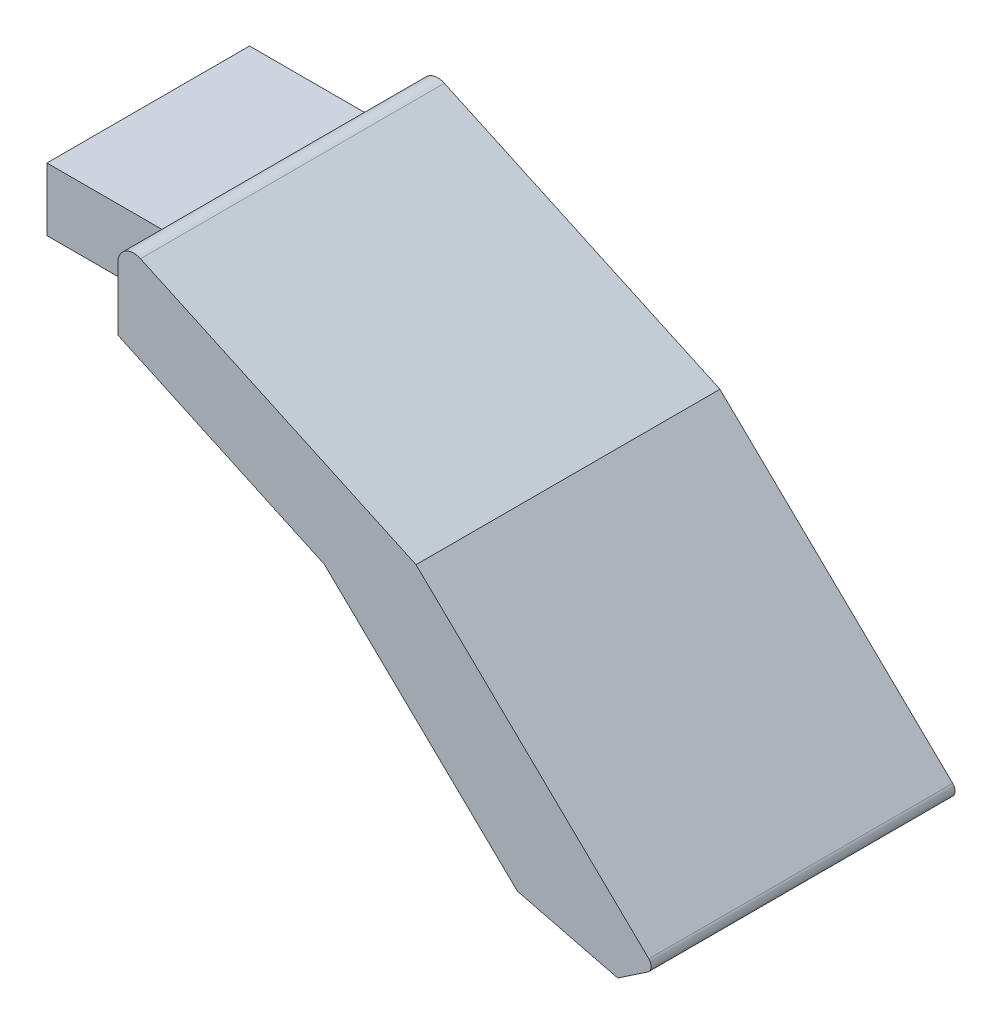
ISO-10303-21;
HEADER;
FILE_DESCRIPTION(('STEP AP214'),'2;1');
FILE_NAME('part.step','',(''),(''),'','','');
FILE_SCHEMA(('AUTOMOTIVE_DESIGN { 1 0 10303 214 1 1 1 1 }'));
ENDSEC;
DATA;
#1=APPLICATION_CONTEXT('core data for automotive mechanical design processes');
#2=APPLICATION_PROTOCOL_DEFINITION('international standard','automotive_design',2000,#1);
#3=PRODUCT_CONTEXT('',#1,'mechanical');
#4=PRODUCT('Part','Part','',(#3));
#5=PRODUCT_RELATED_PRODUCT_CATEGORY('part','',(#4));
#6=PRODUCT_DEFINITION_FORMATION('','',#4);
#7=PRODUCT_DEFINITION_CONTEXT('part definition',#1,'design');
#8=PRODUCT_DEFINITION('design','',#6,#7);
#9=PRODUCT_DEFINITION_SHAPE('','',#8);
#10=(LENGTH_UNIT() NAMED_UNIT(*) SI_UNIT(.MILLI.,.METRE.));
#11=(NAMED_UNIT(*) PLANE_ANGLE_UNIT() SI_UNIT($,.RADIAN.));
#12=(NAMED_UNIT(*) SI_UNIT($,.STERADIAN.) SOLID_ANGLE_UNIT());
#13=UNCERTAINTY_MEASURE_WITH_UNIT(LENGTH_MEASURE(1.E-05),#10,'distance_accuracy_value','');
#14=(GEOMETRIC_REPRESENTATION_CONTEXT(3) GLOBAL_UNCERTAINTY_ASSIGNED_CONTEXT((#13)) GLOBAL_UNIT_ASSIGNED_CONTEXT((#10,
#11,#12)) REPRESENTATION_CONTEXT('',''));
#15=CARTESIAN_POINT('',(0.,0.,0.));
#16=DIRECTION('',(0.,0.,1.));
#17=DIRECTION('',(1.,0.,0.));
#18=AXIS2_PLACEMENT_3D('',#15,#16,#17);
#19=CARTESIAN_POINT('',(20.376413200108,1.84990999305103,15.));
#20=DIRECTION('',(0.694777681754056,0.71922456363535,0.));
#21=DIRECTION('',(-0.71922456363535,0.694777681754056,0.));
#22=AXIS2_PLACEMENT_3D('',#19,#20,#21);
#23=PLANE('',#22);
#24=DIRECTION('',(0.,0.,-1.));
#25=VECTOR('',#24,1.);
#26=CARTESIAN_POINT('',(20.376413200108,1.84990999305103,15.));
#27=LINE('',#26,#25);
#28=CARTESIAN_POINT('',(20.376413200108,1.84990999305103,15.));
#29=VERTEX_POINT('',#28);
#30=CARTESIAN_POINT('',(20.376413200108,1.84990999305103,-15.));
#31=VERTEX_POINT('',#30);
#32=EDGE_CURVE('E11',#29,#31,#27,.T.);
#33=ORIENTED_EDGE('',*,*,#32,.T.);
#34=DIRECTION('',(0.71922456363535,-0.694777681754056,0.));
#35=VECTOR('',#34,1.);
#36=CARTESIAN_POINT('',(20.376413200108,1.84990999305103,-15.));
#37=LINE('',#36,#35);
#38=CARTESIAN_POINT('',(39.444832225006,-16.570361831189,-15.));
#39=VERTEX_POINT('',#38);
#40=EDGE_CURVE('E313',#31,#39,#37,.T.);
#41=ORIENTED_EDGE('',*,*,#40,.T.);
#42=DIRECTION('',(0.,0.,-1.));
#43=VECTOR('',#42,1.);
#44=CARTESIAN_POINT('',(39.444832225006,-16.570361831189,15.));
#45=LINE('',#44,#43);
#46=CARTESIAN_POINT('',(39.444832225006,-16.570361831189,15.));
#47=VERTEX_POINT('',#46);
#48=EDGE_CURVE('E44',#47,#39,#45,.T.);
#49=ORIENTED_EDGE('',*,*,#48,.F.);
#50=DIRECTION('',(0.71922456363535,-0.694777681754056,0.));
#51=VECTOR('',#50,1.);
#52=CARTESIAN_POINT('',(20.376413200108,1.84990999305103,15.));
#53=LINE('',#52,#51);
#54=EDGE_CURVE('E340',#29,#47,#53,.T.);
#55=ORIENTED_EDGE('',*,*,#54,.F.);
#56=EDGE_LOOP('',(#33,#41,#49,#55));
#57=FACE_BOUND('',#56,.T.);
#58=DIRECTION('',(0.,0.,-1.));
#59=VECTOR('',#58,1.);
#60=CARTESIAN_POINT('',(24.6917605819201,-2.3187560974733,-10.));
#61=LINE('',#60,#59);
#62=CARTESIAN_POINT('',(24.6917605819201,-2.3187560974733,10.));
#63=VERTEX_POINT('',#62);
#64=CARTESIAN_POINT('',(24.6917605819201,-2.3187560974733,-10.));
#65=VERTEX_POINT('',#64);
#66=EDGE_CURVE('E216',#63,#65,#61,.T.);
#67=ORIENTED_EDGE('',*,*,#66,.F.);
#68=DIRECTION('',(-0.71922456363535,0.694777681754056,0.));
#69=VECTOR('',#68,1.);
#70=CARTESIAN_POINT('',(35.1294848431939,-12.4016957406646,10.));
#71=LINE('',#70,#69);
#72=CARTESIAN_POINT('',(35.1294848431939,-12.4016957406646,10.));
#73=VERTEX_POINT('',#72);
#74=EDGE_CURVE('E213',#73,#63,#71,.T.);
#75=ORIENTED_EDGE('',*,*,#74,.F.);
#76=DIRECTION('',(0.,0.,1.));
#77=VECTOR('',#76,1.);
#78=CARTESIAN_POINT('',(35.1294848431939,-12.4016957406646,-10.));
#79=LINE('',#78,#77);
#80=CARTESIAN_POINT('',(35.1294848431939,-12.4016957406646,-9.99999999999999));
#81=VERTEX_POINT('',#80);
#82=EDGE_CURVE('E56',#81,#73,#79,.T.);
#83=ORIENTED_EDGE('',*,*,#82,.F.);
#84=DIRECTION('',(0.71922456363535,-0.694777681754056,0.));
#85=VECTOR('',#84,1.);
#86=CARTESIAN_POINT('',(35.1294848431939,-12.4016957406646,-10.));
#87=LINE('',#86,#85);
#88=EDGE_CURVE('E51',#65,#81,#87,.T.);
#89=ORIENTED_EDGE('',*,*,#88,.F.);
#90=EDGE_LOOP('',(#67,#75,#83,#89));
#91=FACE_BOUND('',#90,.T.);
#92=ADVANCED_FACE('F36',(#57,#91),#23,.F.);
#93=CARTESIAN_POINT('',(0.,16.196411571809,15.));
#94=DIRECTION('',(1.,0.,0.));
#95=DIRECTION('',(0.,0.,-1.));
#96=AXIS2_PLACEMENT_3D('',#93,#94,#95);
#97=PLANE('',#96);
#98=DIRECTION('',(0.,1.,0.));
#99=VECTOR('',#98,1.);
#100=CARTESIAN_POINT('',(0.,11.2554334954567,10.));
#101=LINE('',#100,#99);
#102=CARTESIAN_POINT('',(0.,11.2554334954567,10.));
#103=VERTEX_POINT('',#102);
#104=CARTESIAN_POINT('',(0.,17.466411571809,10.));
#105=VERTEX_POINT('',#104);
#106=EDGE_CURVE('E281',#103,#105,#101,.T.);
#107=ORIENTED_EDGE('',*,*,#106,.F.);
#108=DIRECTION('',(0.,0.,-1.));
#109=VECTOR('',#108,1.);
#110=CARTESIAN_POINT('',(0.,11.2554334954567,15.));
#111=LINE('',#110,#109);
#112=CARTESIAN_POINT('',(0.,11.2554334954567,15.));
#113=VERTEX_POINT('',#112);
#114=EDGE_CURVE('E357',#113,#103,#111,.T.);
#115=ORIENTED_EDGE('',*,*,#114,.F.);
#116=DIRECTION('',(0.,-1.,0.));
#117=VECTOR('',#116,1.);
#118=CARTESIAN_POINT('',(0.,17.466411571809,15.));
#119=LINE('',#118,#117);
#120=CARTESIAN_POINT('',(0.,17.466411571809,15.));
#121=VERTEX_POINT('',#120);
#122=EDGE_CURVE('E354',#121,#113,#119,.T.);
#123=ORIENTED_EDGE('',*,*,#122,.F.);
#124=DIRECTION('',(0.,0.,-1.));
#125=VECTOR('',#124,1.);
#126=CARTESIAN_POINT('',(0.,17.466411571809,15.));
#127=LINE('',#126,#125);
#128=EDGE_CURVE('E361',#121,#105,#127,.T.);
#129=ORIENTED_EDGE('',*,*,#128,.T.);
#130=EDGE_LOOP('',(#107,#115,#123,#129));
#131=FACE_BOUND('',#130,.T.);
#132=ADVANCED_FACE('F424',(#131),#97,.F.);
#133=DIRECTION('',(0.,-1.,0.));
#134=VECTOR('',#133,1.);
#135=CARTESIAN_POINT('',(0.,11.2554334954567,-10.));
#136=LINE('',#135,#134);
#137=CARTESIAN_POINT('',(0.,17.466411571809,-10.));
#138=VERTEX_POINT('',#137);
#139=CARTESIAN_POINT('',(0.,11.2554334954567,-10.));
#140=VERTEX_POINT('',#139);
#141=EDGE_CURVE('E297',#138,#140,#136,.T.);
#142=ORIENTED_EDGE('',*,*,#141,.F.);
#143=CARTESIAN_POINT('',(0.,17.466411571809,-15.));
#144=VERTEX_POINT('',#143);
#145=EDGE_CURVE('E360',#138,#144,#127,.T.);
#146=ORIENTED_EDGE('',*,*,#145,.T.);
#147=DIRECTION('',(0.,-1.,0.));
#148=VECTOR('',#147,1.);
#149=CARTESIAN_POINT('',(0.,17.466411571809,-15.));
#150=LINE('',#149,#148);
#151=CARTESIAN_POINT('',(0.,11.2554334954567,-15.));
#152=VERTEX_POINT('',#151);
#153=EDGE_CURVE('E334',#144,#152,#150,.T.);
#154=ORIENTED_EDGE('',*,*,#153,.T.);
#155=EDGE_CURVE('E356',#140,#152,#111,.T.);
#156=ORIENTED_EDGE('',*,*,#155,.F.);
#157=EDGE_LOOP('',(#142,#146,#154,#156));
#158=FACE_BOUND('',#157,.T.);
#159=ADVANCED_FACE('F436',(#158),#97,.F.);
#160=CARTESIAN_POINT('',(0.,11.2554334954567,15.));
#161=DIRECTION('',(0.419095832777023,0.907942004176992,0.));
#162=DIRECTION('',(-0.907942004176992,0.419095832777023,0.));
#163=AXIS2_PLACEMENT_3D('',#160,#161,#162);
#164=PLANE('',#163);
#165=ORIENTED_EDGE('',*,*,#114,.T.);
#166=DIRECTION('',(0.,0.,1.));
#167=VECTOR('',#166,1.);
#168=CARTESIAN_POINT('',(0.,11.2554334954567,-10.));
#169=LINE('',#168,#167);
#170=EDGE_CURVE('E286',#140,#103,#169,.T.);
#171=ORIENTED_EDGE('',*,*,#170,.F.);
#172=ORIENTED_EDGE('',*,*,#155,.T.);
#173=DIRECTION('',(0.907942004176992,-0.419095832777023,0.));
#174=VECTOR('',#173,1.);
#175=CARTESIAN_POINT('',(0.,11.2554334954567,-15.));
#176=LINE('',#175,#174);
#177=EDGE_CURVE('E310',#152,#31,#176,.T.);
#178=ORIENTED_EDGE('',*,*,#177,.T.);
#179=ORIENTED_EDGE('',*,*,#32,.F.);
#180=DIRECTION('',(0.907942004176992,-0.419095832777023,0.));
#181=VECTOR('',#180,1.);
#182=CARTESIAN_POINT('',(0.,11.2554334954567,15.));
#183=LINE('',#182,#181);
#184=EDGE_CURVE('E337',#113,#29,#183,.T.);
#185=ORIENTED_EDGE('',*,*,#184,.F.);
#186=EDGE_LOOP('',(#165,#171,#172,#178,#179,#185));
#187=FACE_BOUND('',#186,.T.);
#188=ADVANCED_FACE('F38',(#187),#164,.F.);
#189=CARTESIAN_POINT('',(39.444832225006,-16.570361831189,15.));
#190=DIRECTION('',(0.24208284056378,0.970255584011023,0.));
#191=DIRECTION('',(-0.970255584011023,0.24208284056378,0.));
#192=AXIS2_PLACEMENT_3D('',#189,#190,#191);
#193=PLANE('',#192);
#194=ORIENTED_EDGE('',*,*,#48,.T.);
#195=DIRECTION('',(0.970255584011023,-0.24208284056378,0.));
#196=VECTOR('',#195,1.);
#197=CARTESIAN_POINT('',(39.444832225006,-16.570361831189,-15.));
#198=LINE('',#197,#196);
#199=CARTESIAN_POINT('',(49.34787100506,-19.041211571809,-15.));
#200=VERTEX_POINT('',#199);
#201=EDGE_CURVE('E316',#39,#200,#198,.T.);
#202=ORIENTED_EDGE('',*,*,#201,.T.);
#203=DIRECTION('',(0.,0.,-1.));
#204=VECTOR('',#203,1.);
#205=CARTESIAN_POINT('',(49.34787100506,-19.041211571809,15.));
#206=LINE('',#205,#204);
#207=CARTESIAN_POINT('',(49.34787100506,-19.041211571809,15.));
#208=VERTEX_POINT('',#207);
#209=EDGE_CURVE('E372',#208,#200,#206,.T.);
#210=ORIENTED_EDGE('',*,*,#209,.F.);
#211=DIRECTION('',(0.970255584011023,-0.24208284056378,0.));
#212=VECTOR('',#211,1.);
#213=CARTESIAN_POINT('',(39.444832225006,-16.570361831189,15.));
#214=LINE('',#213,#212);
#215=EDGE_CURVE('E342',#47,#208,#214,.T.);
#216=ORIENTED_EDGE('',*,*,#215,.F.);
#217=EDGE_LOOP('',(#194,#202,#210,#216));
#218=FACE_BOUND('',#217,.T.);
#219=ADVANCED_FACE('F377',(#218),#193,.F.);
#220=CARTESIAN_POINT('',(49.34787100506,-19.041211571809,15.));
#221=DIRECTION('',(-0.558798570464505,0.82930341711995,0.));
#222=DIRECTION('',(-0.82930341711995,-0.558798570464505,0.));
#223=AXIS2_PLACEMENT_3D('',#220,#221,#222);
#224=PLANE('',#223);
#225=ORIENTED_EDGE('',*,*,#209,.T.);
#226=DIRECTION('',(0.82930341711995,0.558798570464505,0.));
#227=VECTOR('',#226,1.);
#228=CARTESIAN_POINT('',(49.34787100506,-19.041211571809,-15.));
#229=LINE('',#228,#227);
#230=CARTESIAN_POINT('',(52.3163433238,-17.041005068457,-15.));
#231=VERTEX_POINT('',#230);
#232=EDGE_CURVE('E319',#200,#231,#229,.T.);
#233=ORIENTED_EDGE('',*,*,#232,.T.);
#234=DIRECTION('',(0.,0.,-1.));
#235=VECTOR('',#234,1.);
#236=CARTESIAN_POINT('',(52.3163433238,-17.041005068457,15.));
#237=LINE('',#236,#235);
#238=CARTESIAN_POINT('',(52.3163433238,-17.041005068457,15.));
#239=VERTEX_POINT('',#238);
#240=EDGE_CURVE('E370',#239,#231,#237,.T.);
#241=ORIENTED_EDGE('',*,*,#240,.F.);
#242=DIRECTION('',(0.82930341711995,0.558798570464505,0.));
#243=VECTOR('',#242,1.);
#244=CARTESIAN_POINT('',(49.34787100506,-19.041211571809,15.));
#245=LINE('',#244,#243);
#246=EDGE_CURVE('E344',#208,#239,#245,.T.);
#247=ORIENTED_EDGE('',*,*,#246,.F.);
#248=EDGE_LOOP('',(#225,#233,#241,#247));
#249=FACE_BOUND('',#248,.T.);
#250=ADVANCED_FACE('F416',(#249),#224,.F.);
#251=CARTESIAN_POINT('',(51.8905388130872,-16.4090758646114,15.));
#252=DIRECTION('',(0.,0.,-1.));
#253=DIRECTION('',(-1.,0.,0.));
#254=AXIS2_PLACEMENT_3D('',#251,#252,#253);
#255=CYLINDRICAL_SURFACE('',#254,0.762000000010712);
#256=ORIENTED_EDGE('',*,*,#240,.T.);
#257=CARTESIAN_POINT('',(51.8905388130872,-16.4090758646114,-15.));
#258=DIRECTION('',(0.,0.,1.));
#259=DIRECTION('',(1.,0.,0.));
#260=AXIS2_PLACEMENT_3D('',#257,#258,#259);
#261=CIRCLE('',#260,0.762000000010712);
#262=CARTESIAN_POINT('',(52.4199594066001,-15.8610267471221,-15.));
#263=VERTEX_POINT('',#262);
#264=EDGE_CURVE('E322',#231,#263,#261,.T.);
#265=ORIENTED_EDGE('',*,*,#264,.T.);
#266=DIRECTION('',(0.,0.,-1.));
#267=VECTOR('',#266,1.);
#268=CARTESIAN_POINT('',(52.4199594066001,-15.8610267471221,15.));
#269=LINE('',#268,#267);
#270=CARTESIAN_POINT('',(52.4199594066001,-15.8610267471221,15.));
#271=VERTEX_POINT('',#270);
#272=EDGE_CURVE('E368',#271,#263,#269,.T.);
#273=ORIENTED_EDGE('',*,*,#272,.F.);
#274=CARTESIAN_POINT('',(51.8905388130872,-16.4090758646114,15.));
#275=DIRECTION('',(0.,0.,1.));
#276=DIRECTION('',(1.,0.,0.));
#277=AXIS2_PLACEMENT_3D('',#274,#275,#276);
#278=CIRCLE('',#277,0.762000000010712);
#279=EDGE_CURVE('E346',#239,#271,#278,.T.);
#280=ORIENTED_EDGE('',*,*,#279,.F.);
#281=EDGE_LOOP('',(#256,#265,#273,#280));
#282=FACE_BOUND('',#281,.T.);
#283=ADVANCED_FACE('F413',(#282),#255,.T.);
#284=CARTESIAN_POINT('',(52.4199594066001,-15.8610267471221,15.));
#285=DIRECTION('',(-0.69477768175403,-0.719224563635375,0.));
#286=DIRECTION('',(0.719224563635375,-0.69477768175403,0.));
#287=AXIS2_PLACEMENT_3D('',#284,#285,#286);
#288=PLANE('',#287);
#289=ORIENTED_EDGE('',*,*,#272,.T.);
#290=DIRECTION('',(-0.719224563635375,0.69477768175403,0.));
#291=VECTOR('',#290,1.);
#292=CARTESIAN_POINT('',(52.4199594066001,-15.8610267471221,-15.));
#293=LINE('',#292,#291);
#294=CARTESIAN_POINT('',(29.4384330798461,6.33934347350093,-15.));
#295=VERTEX_POINT('',#294);
#296=EDGE_CURVE('E325',#263,#295,#293,.T.);
#297=ORIENTED_EDGE('',*,*,#296,.T.);
#298=DIRECTION('',(0.,0.,-1.));
#299=VECTOR('',#298,1.);
#300=CARTESIAN_POINT('',(29.4384330798461,6.33934347350093,15.));
#301=LINE('',#300,#299);
#302=CARTESIAN_POINT('',(29.4384330798461,6.33934347350093,15.));
#303=VERTEX_POINT('',#302);
#304=EDGE_CURVE('E366',#303,#295,#301,.T.);
#305=ORIENTED_EDGE('',*,*,#304,.F.);
#306=DIRECTION('',(-0.719224563635375,0.69477768175403,0.));
#307=VECTOR('',#306,1.);
#308=CARTESIAN_POINT('',(52.4199594066001,-15.8610267471221,15.));
#309=LINE('',#308,#307);
#310=EDGE_CURVE('E348',#271,#303,#309,.T.);
#311=ORIENTED_EDGE('',*,*,#310,.F.);
#312=EDGE_LOOP('',(#289,#297,#305,#311));
#313=FACE_BOUND('',#312,.T.);
#314=ADVANCED_FACE('F408',(#313),#288,.F.);
#315=CARTESIAN_POINT('',(29.4384330798461,6.33934347350093,15.));
#316=DIRECTION('',(-0.419095832777027,-0.90794200417699,0.));
#317=DIRECTION('',(0.907942004176991,-0.419095832777027,0.));
#318=AXIS2_PLACEMENT_3D('',#315,#316,#317);
#319=PLANE('',#318);
#320=ORIENTED_EDGE('',*,*,#304,.T.);
#321=DIRECTION('',(-0.90794200417699,0.419095832777027,0.));
#322=VECTOR('',#321,1.);
#323=CARTESIAN_POINT('',(29.4384330798461,6.33934347350093,-15.));
#324=LINE('',#323,#322);
#325=CARTESIAN_POINT('',(2.23479211745707,18.8962386399869,-15.));
#326=VERTEX_POINT('',#325);
#327=EDGE_CURVE('E328',#295,#326,#324,.T.);
#328=ORIENTED_EDGE('',*,*,#327,.T.);
#329=DIRECTION('',(0.,0.,-1.));
#330=VECTOR('',#329,1.);
#331=CARTESIAN_POINT('',(2.23479211745707,18.8962386399869,15.));
#332=LINE('',#331,#330);
#333=CARTESIAN_POINT('',(2.23479211745707,18.8962386399869,15.));
#334=VERTEX_POINT('',#333);
#335=EDGE_CURVE('E364',#334,#326,#332,.T.);
#336=ORIENTED_EDGE('',*,*,#335,.F.);
#337=DIRECTION('',(-0.90794200417699,0.419095832777027,0.));
#338=VECTOR('',#337,1.);
#339=CARTESIAN_POINT('',(29.4384330798461,6.33934347350093,15.));
#340=LINE('',#339,#338);
#341=EDGE_CURVE('E350',#303,#334,#340,.T.);
#342=ORIENTED_EDGE('',*,*,#341,.F.);
#343=EDGE_LOOP('',(#320,#328,#336,#342));
#344=FACE_BOUND('',#343,.T.);
#345=ADVANCED_FACE('F404',(#344),#319,.F.);
#346=CARTESIAN_POINT('',(1.57480000000012,17.4664115718087,15.));
#347=DIRECTION('',(0.,0.,-1.));
#348=DIRECTION('',(-1.,0.,0.));
#349=AXIS2_PLACEMENT_3D('',#346,#347,#348);
#350=CYLINDRICAL_SURFACE('',#349,1.57480000000011);
#351=ORIENTED_EDGE('',*,*,#335,.T.);
#352=CARTESIAN_POINT('',(1.57480000000012,17.4664115718087,-15.));
#353=DIRECTION('',(0.,0.,1.));
#354=DIRECTION('',(1.,0.,0.));
#355=AXIS2_PLACEMENT_3D('',#352,#353,#354);
#356=CIRCLE('',#355,1.57480000000011);
#357=EDGE_CURVE('E331',#326,#144,#356,.T.);
#358=ORIENTED_EDGE('',*,*,#357,.T.);
#359=ORIENTED_EDGE('',*,*,#145,.F.);
#360=DIRECTION('',(0.,0.,-1.));
#361=VECTOR('',#360,1.);
#362=CARTESIAN_POINT('',(0.,17.466411571809,-10.));
#363=LINE('',#362,#361);
#364=EDGE_CURVE('E295',#105,#138,#363,.T.);
#365=ORIENTED_EDGE('',*,*,#364,.F.);
#366=ORIENTED_EDGE('',*,*,#128,.F.);
#367=CARTESIAN_POINT('',(1.57480000000012,17.4664115718087,15.));
#368=DIRECTION('',(0.,0.,1.));
#369=DIRECTION('',(1.,0.,0.));
#370=AXIS2_PLACEMENT_3D('',#367,#368,#369);
#371=CIRCLE('',#370,1.57480000000011);
#372=EDGE_CURVE('E352',#334,#121,#371,.T.);
#373=ORIENTED_EDGE('',*,*,#372,.F.);
#374=EDGE_LOOP('',(#351,#358,#359,#365,#366,#373));
#375=FACE_BOUND('',#374,.T.);
#376=ADVANCED_FACE('F397',(#375),#350,.T.);
#377=CARTESIAN_POINT('',(51.8905388130872,-16.4090758646114,15.));
#378=DIRECTION('',(0.,0.,1.));
#379=DIRECTION('',(1.,0.,0.));
#380=AXIS2_PLACEMENT_3D('',#377,#378,#379);
#381=PLANE('',#380);
#382=ORIENTED_EDGE('',*,*,#184,.T.);
#383=ORIENTED_EDGE('',*,*,#54,.T.);
#384=ORIENTED_EDGE('',*,*,#215,.T.);
#385=ORIENTED_EDGE('',*,*,#246,.T.);
#386=ORIENTED_EDGE('',*,*,#279,.T.);
#387=ORIENTED_EDGE('',*,*,#310,.T.);
#388=ORIENTED_EDGE('',*,*,#341,.T.);
#389=ORIENTED_EDGE('',*,*,#372,.T.);
#390=ORIENTED_EDGE('',*,*,#122,.T.);
#391=EDGE_LOOP('',(#382,#383,#384,#385,#386,#387,#388,#389,#390));
#392=FACE_BOUND('',#391,.T.);
#393=ADVANCED_FACE('F419',(#392),#381,.T.);
#394=CARTESIAN_POINT('',(51.8905388130872,-16.4090758646114,-15.));
#395=DIRECTION('',(0.,0.,1.));
#396=DIRECTION('',(1.,0.,0.));
#397=AXIS2_PLACEMENT_3D('',#394,#395,#396);
#398=PLANE('',#397);
#399=ORIENTED_EDGE('',*,*,#177,.F.);
#400=ORIENTED_EDGE('',*,*,#153,.F.);
#401=ORIENTED_EDGE('',*,*,#357,.F.);
#402=ORIENTED_EDGE('',*,*,#327,.F.);
#403=ORIENTED_EDGE('',*,*,#296,.F.);
#404=ORIENTED_EDGE('',*,*,#264,.F.);
#405=ORIENTED_EDGE('',*,*,#232,.F.);
#406=ORIENTED_EDGE('',*,*,#201,.F.);
#407=ORIENTED_EDGE('',*,*,#40,.F.);
#408=EDGE_LOOP('',(#399,#400,#401,#402,#403,#404,#405,#406,#407));
#409=FACE_BOUND('',#408,.T.);
#410=ADVANCED_FACE('F384',(#409),#398,.F.);
#411=CARTESIAN_POINT('',(-12.,11.2554334954567,10.));
#412=DIRECTION('',(0.,0.,-1.));
#413=DIRECTION('',(-1.,0.,0.));
#414=AXIS2_PLACEMENT_3D('',#411,#412,#413);
#415=PLANE('',#414);
#416=DIRECTION('',(1.,0.,0.));
#417=VECTOR('',#416,1.);
#418=CARTESIAN_POINT('',(-12.,11.2554334954567,10.));
#419=LINE('',#418,#417);
#420=CARTESIAN_POINT('',(-12.,11.2554334954567,10.));
#421=VERTEX_POINT('',#420);
#422=EDGE_CURVE('E292',#421,#103,#419,.T.);
#423=ORIENTED_EDGE('',*,*,#422,.T.);
#424=ORIENTED_EDGE('',*,*,#106,.T.);
#425=DIRECTION('',(1.,0.,0.));
#426=VECTOR('',#425,1.);
#427=CARTESIAN_POINT('',(-12.,17.466411571809,10.));
#428=LINE('',#427,#426);
#429=CARTESIAN_POINT('',(-12.,17.466411571809,10.));
#430=VERTEX_POINT('',#429);
#431=EDGE_CURVE('E308',#430,#105,#428,.T.);
#432=ORIENTED_EDGE('',*,*,#431,.F.);
#433=DIRECTION('',(0.,1.,0.));
#434=VECTOR('',#433,1.);
#435=CARTESIAN_POINT('',(-12.,11.2554334954567,10.));
#436=LINE('',#435,#434);
#437=EDGE_CURVE('E282',#421,#430,#436,.T.);
#438=ORIENTED_EDGE('',*,*,#437,.F.);
#439=EDGE_LOOP('',(#423,#424,#432,#438));
#440=FACE_BOUND('',#439,.T.);
#441=ADVANCED_FACE('F465',(#440),#415,.F.);
#442=CARTESIAN_POINT('',(-12.,17.466411571809,-10.));
#443=DIRECTION('',(0.,-1.,0.));
#444=DIRECTION('',(0.,0.,-1.));
#445=AXIS2_PLACEMENT_3D('',#442,#443,#444);
#446=PLANE('',#445);
#447=ORIENTED_EDGE('',*,*,#364,.T.);
#448=DIRECTION('',(1.,0.,0.));
#449=VECTOR('',#448,1.);
#450=CARTESIAN_POINT('',(-12.,17.466411571809,-10.));
#451=LINE('',#450,#449);
#452=CARTESIAN_POINT('',(-12.,17.466411571809,-10.));
#453=VERTEX_POINT('',#452);
#454=EDGE_CURVE('E305',#453,#138,#451,.T.);
#455=ORIENTED_EDGE('',*,*,#454,.F.);
#456=DIRECTION('',(0.,0.,-1.));
#457=VECTOR('',#456,1.);
#458=CARTESIAN_POINT('',(-12.,17.466411571809,-10.));
#459=LINE('',#458,#457);
#460=EDGE_CURVE('E285',#430,#453,#459,.T.);
#461=ORIENTED_EDGE('',*,*,#460,.F.);
#462=ORIENTED_EDGE('',*,*,#431,.T.);
#463=EDGE_LOOP('',(#447,#455,#461,#462));
#464=FACE_BOUND('',#463,.T.);
#465=ADVANCED_FACE('F470',(#464),#446,.F.);
#466=CARTESIAN_POINT('',(-12.,11.2554334954567,-10.));
#467=DIRECTION('',(0.,0.,1.));
#468=DIRECTION('',(1.,0.,0.));
#469=AXIS2_PLACEMENT_3D('',#466,#467,#468);
#470=PLANE('',#469);
#471=ORIENTED_EDGE('',*,*,#141,.T.);
#472=DIRECTION('',(1.,0.,0.));
#473=VECTOR('',#472,1.);
#474=CARTESIAN_POINT('',(-12.,11.2554334954567,-10.));
#475=LINE('',#474,#473);
#476=CARTESIAN_POINT('',(-12.,11.2554334954567,-10.));
#477=VERTEX_POINT('',#476);
#478=EDGE_CURVE('E303',#477,#140,#475,.T.);
#479=ORIENTED_EDGE('',*,*,#478,.F.);
#480=DIRECTION('',(0.,-1.,0.));
#481=VECTOR('',#480,1.);
#482=CARTESIAN_POINT('',(-12.,11.2554334954567,-10.));
#483=LINE('',#482,#481);
#484=EDGE_CURVE('E288',#453,#477,#483,.T.);
#485=ORIENTED_EDGE('',*,*,#484,.F.);
#486=ORIENTED_EDGE('',*,*,#454,.T.);
#487=EDGE_LOOP('',(#471,#479,#485,#486));
#488=FACE_BOUND('',#487,.T.);
#489=ADVANCED_FACE('F434',(#488),#470,.F.);
#490=CARTESIAN_POINT('',(-12.,11.2554334954567,-10.));
#491=DIRECTION('',(0.,1.,0.));
#492=DIRECTION('',(0.,0.,1.));
#493=AXIS2_PLACEMENT_3D('',#490,#491,#492);
#494=PLANE('',#493);
#495=DIRECTION('',(0.,0.,1.));
#496=VECTOR('',#495,1.);
#497=CARTESIAN_POINT('',(-1.5,11.2554334954567,-10.));
#498=LINE('',#497,#496);
#499=CARTESIAN_POINT('',(-1.5,11.2554334954567,-7.));
#500=VERTEX_POINT('',#499);
#501=CARTESIAN_POINT('',(-1.5,11.2554334954567,7.));
#502=VERTEX_POINT('',#501);
#503=EDGE_CURVE('E278',#500,#502,#498,.T.);
#504=ORIENTED_EDGE('',*,*,#503,.F.);
#505=DIRECTION('',(-1.,0.,0.));
#506=VECTOR('',#505,1.);
#507=CARTESIAN_POINT('',(-0.700000000000002,11.2554334954567,-7.));
#508=LINE('',#507,#506);
#509=CARTESIAN_POINT('',(-4.5,11.2554334954567,-7.));
#510=VERTEX_POINT('',#509);
#511=EDGE_CURVE('E233',#500,#510,#508,.T.);
#512=ORIENTED_EDGE('',*,*,#511,.T.);
#513=DIRECTION('',(0.,0.,1.));
#514=VECTOR('',#513,1.);
#515=CARTESIAN_POINT('',(-4.5,11.2554334954567,-10.));
#516=LINE('',#515,#514);
#517=CARTESIAN_POINT('',(-4.5,11.2554334954567,7.));
#518=VERTEX_POINT('',#517);
#519=EDGE_CURVE('E260',#510,#518,#516,.T.);
#520=ORIENTED_EDGE('',*,*,#519,.T.);
#521=DIRECTION('',(-1.,0.,0.));
#522=VECTOR('',#521,1.);
#523=CARTESIAN_POINT('',(-0.700000000000002,11.2554334954567,7.));
#524=LINE('',#523,#522);
#525=EDGE_CURVE('E238',#502,#518,#524,.T.);
#526=ORIENTED_EDGE('',*,*,#525,.F.);
#527=EDGE_LOOP('',(#504,#512,#520,#526));
#528=FACE_BOUND('',#527,.T.);
#529=ORIENTED_EDGE('',*,*,#478,.T.);
#530=ORIENTED_EDGE('',*,*,#170,.T.);
#531=ORIENTED_EDGE('',*,*,#422,.F.);
#532=DIRECTION('',(0.,0.,1.));
#533=VECTOR('',#532,1.);
#534=CARTESIAN_POINT('',(-12.,11.2554334954567,-10.));
#535=LINE('',#534,#533);
#536=EDGE_CURVE('E290',#477,#421,#535,.T.);
#537=ORIENTED_EDGE('',*,*,#536,.F.);
#538=EDGE_LOOP('',(#529,#530,#531,#537));
#539=FACE_BOUND('',#538,.T.);
#540=ADVANCED_FACE('F427',(#528,#539),#494,.F.);
#541=CARTESIAN_POINT('',(-12.,0.,0.));
#542=DIRECTION('',(1.,0.,0.));
#543=DIRECTION('',(0.,0.,-1.));
#544=AXIS2_PLACEMENT_3D('',#541,#542,#543);
#545=PLANE('',#544);
#546=ORIENTED_EDGE('',*,*,#437,.T.);
#547=ORIENTED_EDGE('',*,*,#460,.T.);
#548=ORIENTED_EDGE('',*,*,#484,.T.);
#549=ORIENTED_EDGE('',*,*,#536,.T.);
#550=EDGE_LOOP('',(#546,#547,#548,#549));
#551=FACE_BOUND('',#550,.T.);
#552=ADVANCED_FACE('F479',(#551),#545,.F.);
#553=CARTESIAN_POINT('',(-1.5,11.2554334954567,-10.));
#554=DIRECTION('',(-1.,0.,0.));
#555=DIRECTION('',(0.,-1.,0.));
#556=AXIS2_PLACEMENT_3D('',#553,#554,#555);
#557=PLANE('',#556);
#558=DIRECTION('',(0.,0.,1.));
#559=VECTOR('',#558,1.);
#560=CARTESIAN_POINT('',(-1.5,6.25543349545668,-10.));
#561=LINE('',#560,#559);
#562=CARTESIAN_POINT('',(-1.5,6.25543349545668,-7.));
#563=VERTEX_POINT('',#562);
#564=CARTESIAN_POINT('',(-1.5,6.25543349545668,7.));
#565=VERTEX_POINT('',#564);
#566=EDGE_CURVE('E275',#563,#565,#561,.T.);
#567=ORIENTED_EDGE('',*,*,#566,.F.);
#568=DIRECTION('',(0.,1.,0.));
#569=VECTOR('',#568,1.);
#570=CARTESIAN_POINT('',(-1.5,11.2554334954567,-7.));
#571=LINE('',#570,#569);
#572=EDGE_CURVE('E257',#563,#500,#571,.T.);
#573=ORIENTED_EDGE('',*,*,#572,.T.);
#574=ORIENTED_EDGE('',*,*,#503,.T.);
#575=DIRECTION('',(0.,-1.,0.));
#576=VECTOR('',#575,1.);
#577=CARTESIAN_POINT('',(-1.5,11.2554334954567,7.));
#578=LINE('',#577,#576);
#579=EDGE_CURVE('E248',#502,#565,#578,.T.);
#580=ORIENTED_EDGE('',*,*,#579,.T.);
#581=EDGE_LOOP('',(#567,#573,#574,#580));
#582=FACE_BOUND('',#581,.T.);
#583=ADVANCED_FACE('F483',(#582),#557,.F.);
#584=CARTESIAN_POINT('',(-1.5,6.25543349545668,-10.));
#585=DIRECTION('',(0.,-1.,0.));
#586=DIRECTION('',(0.,0.,-1.));
#587=AXIS2_PLACEMENT_3D('',#584,#585,#586);
#588=PLANE('',#587);
#589=DIRECTION('',(0.,0.,1.));
#590=VECTOR('',#589,1.);
#591=CARTESIAN_POINT('',(-0.7,6.25543349545668,-10.));
#592=LINE('',#591,#590);
#593=CARTESIAN_POINT('',(-0.7,6.25543349545668,-7.));
#594=VERTEX_POINT('',#593);
#595=CARTESIAN_POINT('',(-0.7,6.25543349545668,7.));
#596=VERTEX_POINT('',#595);
#597=EDGE_CURVE('E272',#594,#596,#592,.T.);
#598=ORIENTED_EDGE('',*,*,#597,.F.);
#599=DIRECTION('',(-1.,0.,0.));
#600=VECTOR('',#599,1.);
#601=CARTESIAN_POINT('',(-1.5,6.25543349545668,-7.));
#602=LINE('',#601,#600);
#603=EDGE_CURVE('E254',#594,#563,#602,.T.);
#604=ORIENTED_EDGE('',*,*,#603,.T.);
#605=ORIENTED_EDGE('',*,*,#566,.T.);
#606=DIRECTION('',(1.,0.,0.));
#607=VECTOR('',#606,1.);
#608=CARTESIAN_POINT('',(-1.5,6.25543349545668,7.));
#609=LINE('',#608,#607);
#610=EDGE_CURVE('E245',#565,#596,#609,.T.);
#611=ORIENTED_EDGE('',*,*,#610,.T.);
#612=EDGE_LOOP('',(#598,#604,#605,#611));
#613=FACE_BOUND('',#612,.T.);
#614=ADVANCED_FACE('F487',(#613),#588,.F.);
#615=CARTESIAN_POINT('',(-0.7,6.25543349545668,-10.));
#616=DIRECTION('',(-1.,0.,0.));
#617=DIRECTION('',(0.,-1.,0.));
#618=AXIS2_PLACEMENT_3D('',#615,#616,#617);
#619=PLANE('',#618);
#620=DIRECTION('',(0.,0.,1.));
#621=VECTOR('',#620,1.);
#622=CARTESIAN_POINT('',(-0.7,6.01573182844009,-10.));
#623=LINE('',#622,#621);
#624=CARTESIAN_POINT('',(-0.7,6.01573182844009,-7.));
#625=VERTEX_POINT('',#624);
#626=CARTESIAN_POINT('',(-0.7,6.01573182844009,7.));
#627=VERTEX_POINT('',#626);
#628=EDGE_CURVE('E269',#625,#627,#623,.T.);
#629=ORIENTED_EDGE('',*,*,#628,.F.);
#630=DIRECTION('',(0.,1.,0.));
#631=VECTOR('',#630,1.);
#632=CARTESIAN_POINT('',(-0.700000000000002,11.2554334954567,-7.));
#633=LINE('',#632,#631);
#634=EDGE_CURVE('E225',#625,#594,#633,.T.);
#635=ORIENTED_EDGE('',*,*,#634,.T.);
#636=ORIENTED_EDGE('',*,*,#597,.T.);
#637=DIRECTION('',(0.,-1.,0.));
#638=VECTOR('',#637,1.);
#639=CARTESIAN_POINT('',(-0.700000000000002,11.2554334954567,7.));
#640=LINE('',#639,#638);
#641=EDGE_CURVE('E219',#596,#627,#640,.T.);
#642=ORIENTED_EDGE('',*,*,#641,.T.);
#643=EDGE_LOOP('',(#629,#635,#636,#642));
#644=FACE_BOUND('',#643,.T.);
#645=ADVANCED_FACE('F491',(#644),#619,.F.);
#646=CARTESIAN_POINT('',(-0.7,6.01573182844009,-10.));
#647=DIRECTION('',(-0.688891532112094,0.724864440419208,0.));
#648=DIRECTION('',(-0.724864440419208,-0.688891532112094,0.));
#649=AXIS2_PLACEMENT_3D('',#646,#647,#648);
#650=PLANE('',#649);
#651=DIRECTION('',(0.,0.,1.));
#652=VECTOR('',#651,1.);
#653=CARTESIAN_POINT('',(-1.5,5.25543349545668,-10.));
#654=LINE('',#653,#652);
#655=CARTESIAN_POINT('',(-1.5,5.25543349545668,-7.));
#656=VERTEX_POINT('',#655);
#657=CARTESIAN_POINT('',(-1.5,5.25543349545668,7.));
#658=VERTEX_POINT('',#657);
#659=EDGE_CURVE('E266',#656,#658,#654,.T.);
#660=ORIENTED_EDGE('',*,*,#659,.F.);
#661=DIRECTION('',(0.724864440419208,0.688891532112094,0.));
#662=VECTOR('',#661,1.);
#663=CARTESIAN_POINT('',(-0.7,6.01573182844009,-7.));
#664=LINE('',#663,#662);
#665=EDGE_CURVE('E251',#656,#625,#664,.T.);
#666=ORIENTED_EDGE('',*,*,#665,.T.);
#667=ORIENTED_EDGE('',*,*,#628,.T.);
#668=DIRECTION('',(-0.724864440419208,-0.688891532112094,0.));
#669=VECTOR('',#668,1.);
#670=CARTESIAN_POINT('',(-0.699999999999999,6.01573182844009,7.));
#671=LINE('',#670,#669);
#672=EDGE_CURVE('E235',#627,#658,#671,.T.);
#673=ORIENTED_EDGE('',*,*,#672,.T.);
#674=EDGE_LOOP('',(#660,#666,#667,#673));
#675=FACE_BOUND('',#674,.T.);
#676=ADVANCED_FACE('F495',(#675),#650,.F.);
#677=CARTESIAN_POINT('',(-4.5,5.25543349545668,-10.));
#678=DIRECTION('',(0.,-1.,0.));
#679=DIRECTION('',(0.,0.,-1.));
#680=AXIS2_PLACEMENT_3D('',#677,#678,#679);
#681=PLANE('',#680);
#682=DIRECTION('',(-1.,0.,0.));
#683=VECTOR('',#682,1.);
#684=CARTESIAN_POINT('',(-0.7,5.25543349545668,-7.));
#685=LINE('',#684,#683);
#686=CARTESIAN_POINT('',(-4.5,5.25543349545668,-7.));
#687=VERTEX_POINT('',#686);
#688=EDGE_CURVE('E228',#656,#687,#685,.T.);
#689=ORIENTED_EDGE('',*,*,#688,.F.);
#690=ORIENTED_EDGE('',*,*,#659,.T.);
#691=DIRECTION('',(-1.,0.,0.));
#692=VECTOR('',#691,1.);
#693=CARTESIAN_POINT('',(-0.7,5.25543349545668,7.));
#694=LINE('',#693,#692);
#695=CARTESIAN_POINT('',(-4.5,5.25543349545668,7.));
#696=VERTEX_POINT('',#695);
#697=EDGE_CURVE('E232',#658,#696,#694,.T.);
#698=ORIENTED_EDGE('',*,*,#697,.T.);
#699=DIRECTION('',(0.,0.,1.));
#700=VECTOR('',#699,1.);
#701=CARTESIAN_POINT('',(-4.5,5.25543349545668,-10.));
#702=LINE('',#701,#700);
#703=EDGE_CURVE('E263',#687,#696,#702,.T.);
#704=ORIENTED_EDGE('',*,*,#703,.F.);
#705=EDGE_LOOP('',(#689,#690,#698,#704));
#706=FACE_BOUND('',#705,.T.);
#707=ADVANCED_FACE('F499',(#706),#681,.T.);
#708=CARTESIAN_POINT('',(-4.5,11.2554334954567,-10.));
#709=DIRECTION('',(-1.,0.,0.));
#710=DIRECTION('',(0.,0.,1.));
#711=AXIS2_PLACEMENT_3D('',#708,#709,#710);
#712=PLANE('',#711);
#713=DIRECTION('',(0.,1.,0.));
#714=VECTOR('',#713,1.);
#715=CARTESIAN_POINT('',(-4.5,11.2554334954567,-7.));
#716=LINE('',#715,#714);
#717=EDGE_CURVE('E229',#687,#510,#716,.T.);
#718=ORIENTED_EDGE('',*,*,#717,.F.);
#719=ORIENTED_EDGE('',*,*,#703,.T.);
#720=DIRECTION('',(0.,-1.,0.));
#721=VECTOR('',#720,1.);
#722=CARTESIAN_POINT('',(-4.5,11.2554334954567,7.));
#723=LINE('',#722,#721);
#724=EDGE_CURVE('E217',#518,#696,#723,.T.);
#725=ORIENTED_EDGE('',*,*,#724,.F.);
#726=ORIENTED_EDGE('',*,*,#519,.F.);
#727=EDGE_LOOP('',(#718,#719,#725,#726));
#728=FACE_BOUND('',#727,.T.);
#729=ADVANCED_FACE('F503',(#728),#712,.T.);
#730=CARTESIAN_POINT('',(-0.700000000000002,11.2554334954567,7.));
#731=DIRECTION('',(0.,0.,-1.));
#732=DIRECTION('',(0.,1.,0.));
#733=AXIS2_PLACEMENT_3D('',#730,#731,#732);
#734=PLANE('',#733);
#735=ORIENTED_EDGE('',*,*,#525,.T.);
#736=ORIENTED_EDGE('',*,*,#724,.T.);
#737=ORIENTED_EDGE('',*,*,#697,.F.);
#738=ORIENTED_EDGE('',*,*,#672,.F.);
#739=ORIENTED_EDGE('',*,*,#641,.F.);
#740=ORIENTED_EDGE('',*,*,#610,.F.);
#741=ORIENTED_EDGE('',*,*,#579,.F.);
#742=EDGE_LOOP('',(#735,#736,#737,#738,#739,#740,#741));
#743=FACE_BOUND('',#742,.T.);
#744=ADVANCED_FACE('F507',(#743),#734,.F.);
#745=CARTESIAN_POINT('',(-0.700000000000002,11.2554334954567,-7.));
#746=DIRECTION('',(0.,0.,1.));
#747=DIRECTION('',(0.,-1.,0.));
#748=AXIS2_PLACEMENT_3D('',#745,#746,#747);
#749=PLANE('',#748);
#750=ORIENTED_EDGE('',*,*,#603,.F.);
#751=ORIENTED_EDGE('',*,*,#634,.F.);
#752=ORIENTED_EDGE('',*,*,#665,.F.);
#753=ORIENTED_EDGE('',*,*,#688,.T.);
#754=ORIENTED_EDGE('',*,*,#717,.T.);
#755=ORIENTED_EDGE('',*,*,#511,.F.);
#756=ORIENTED_EDGE('',*,*,#572,.F.);
#757=EDGE_LOOP('',(#750,#751,#752,#753,#754,#755,#756));
#758=FACE_BOUND('',#757,.T.);
#759=ADVANCED_FACE('F511',(#758),#749,.F.);
#760=CARTESIAN_POINT('',(22.6074275366579,-4.47642978837935,-10.));
#761=DIRECTION('',(0.71922456363535,-0.694777681754056,0.));
#762=DIRECTION('',(0.694777681754056,0.71922456363535,0.));
#763=AXIS2_PLACEMENT_3D('',#760,#761,#762);
#764=PLANE('',#763);
#765=ORIENTED_EDGE('',*,*,#66,.T.);
#766=DIRECTION('',(0.694777681754056,0.71922456363535,0.));
#767=VECTOR('',#766,1.);
#768=CARTESIAN_POINT('',(22.6074275366579,-4.47642978837935,-10.));
#769=LINE('',#768,#767);
#770=CARTESIAN_POINT('',(22.6074275366579,-4.47642978837935,-10.));
#771=VERTEX_POINT('',#770);
#772=EDGE_CURVE('E197',#771,#65,#769,.T.);
#773=ORIENTED_EDGE('',*,*,#772,.F.);
#774=DIRECTION('',(0.,0.,-1.));
#775=VECTOR('',#774,1.);
#776=CARTESIAN_POINT('',(22.6074275366579,-4.47642978837935,-10.));
#777=LINE('',#776,#775);
#778=CARTESIAN_POINT('',(22.6074275366579,-4.47642978837935,10.));
#779=VERTEX_POINT('',#778);
#780=EDGE_CURVE('E204',#779,#771,#777,.T.);
#781=ORIENTED_EDGE('',*,*,#780,.F.);
#782=DIRECTION('',(0.694777681754056,0.71922456363535,0.));
#783=VECTOR('',#782,1.);
#784=CARTESIAN_POINT('',(22.6074275366579,-4.47642978837935,10.));
#785=LINE('',#784,#783);
#786=EDGE_CURVE('E731',#779,#63,#785,.T.);
#787=ORIENTED_EDGE('',*,*,#786,.T.);
#788=EDGE_LOOP('',(#765,#773,#781,#787));
#789=FACE_BOUND('',#788,.T.);
#790=ADVANCED_FACE('F215',(#789),#764,.F.);
#791=CARTESIAN_POINT('',(33.0451517979317,-14.5593694315707,-10.));
#792=DIRECTION('',(0.,0.,1.));
#793=DIRECTION('',(1.,0.,0.));
#794=AXIS2_PLACEMENT_3D('',#791,#792,#793);
#795=PLANE('',#794);
#796=ORIENTED_EDGE('',*,*,#88,.T.);
#797=DIRECTION('',(0.694777681754056,0.71922456363535,0.));
#798=VECTOR('',#797,1.);
#799=CARTESIAN_POINT('',(33.0451517979317,-14.5593694315707,-10.));
#800=LINE('',#799,#798);
#801=CARTESIAN_POINT('',(33.0451517979317,-14.5593694315707,-10.));
#802=VERTEX_POINT('',#801);
#803=EDGE_CURVE('E200',#802,#81,#800,.T.);
#804=ORIENTED_EDGE('',*,*,#803,.F.);
#805=DIRECTION('',(0.71922456363535,-0.694777681754056,0.));
#806=VECTOR('',#805,1.);
#807=CARTESIAN_POINT('',(33.0451517979317,-14.5593694315707,-10.));
#808=LINE('',#807,#806);
#809=EDGE_CURVE('E193',#771,#802,#808,.T.);
#810=ORIENTED_EDGE('',*,*,#809,.F.);
#811=ORIENTED_EDGE('',*,*,#772,.T.);
#812=EDGE_LOOP('',(#796,#804,#810,#811));
#813=FACE_BOUND('',#812,.T.);
#814=ADVANCED_FACE('F195',(#813),#795,.F.);
#815=CARTESIAN_POINT('',(33.0451517979317,-14.5593694315707,-10.));
#816=DIRECTION('',(-0.71922456363535,0.694777681754056,0.));
#817=DIRECTION('',(-0.694777681754056,-0.71922456363535,0.));
#818=AXIS2_PLACEMENT_3D('',#815,#816,#817);
#819=PLANE('',#818);
#820=ORIENTED_EDGE('',*,*,#82,.T.);
#821=DIRECTION('',(0.694777681754056,0.71922456363535,0.));
#822=VECTOR('',#821,1.);
#823=CARTESIAN_POINT('',(33.0451517979317,-14.5593694315707,10.));
#824=LINE('',#823,#822);
#825=CARTESIAN_POINT('',(33.0451517979317,-14.5593694315707,10.));
#826=VERTEX_POINT('',#825);
#827=EDGE_CURVE('E221',#826,#73,#824,.T.);
#828=ORIENTED_EDGE('',*,*,#827,.F.);
#829=DIRECTION('',(0.,0.,1.));
#830=VECTOR('',#829,1.);
#831=CARTESIAN_POINT('',(33.0451517979317,-14.5593694315707,-10.));
#832=LINE('',#831,#830);
#833=EDGE_CURVE('E203',#802,#826,#832,.T.);
#834=ORIENTED_EDGE('',*,*,#833,.F.);
#835=ORIENTED_EDGE('',*,*,#803,.T.);
#836=EDGE_LOOP('',(#820,#828,#834,#835));
#837=FACE_BOUND('',#836,.T.);
#838=ADVANCED_FACE('F520',(#837),#819,.F.);
#839=CARTESIAN_POINT('',(33.0451517979317,-14.5593694315707,10.));
#840=DIRECTION('',(0.,0.,-1.));
#841=DIRECTION('',(-1.,0.,0.));
#842=AXIS2_PLACEMENT_3D('',#839,#840,#841);
#843=PLANE('',#842);
#844=ORIENTED_EDGE('',*,*,#74,.T.);
#845=ORIENTED_EDGE('',*,*,#786,.F.);
#846=DIRECTION('',(-0.71922456363535,0.694777681754056,0.));
#847=VECTOR('',#846,1.);
#848=CARTESIAN_POINT('',(33.0451517979317,-14.5593694315707,10.));
#849=LINE('',#848,#847);
#850=EDGE_CURVE('E209',#826,#779,#849,.T.);
#851=ORIENTED_EDGE('',*,*,#850,.F.);
#852=ORIENTED_EDGE('',*,*,#827,.T.);
#853=EDGE_LOOP('',(#844,#845,#851,#852));
#854=FACE_BOUND('',#853,.T.);
#855=ADVANCED_FACE('F523',(#854),#843,.F.);
#856=CARTESIAN_POINT('',(8.6760903776397,8.9813727179102,0.));
#857=DIRECTION('',(-0.694777681754056,-0.71922456363535,0.));
#858=DIRECTION('',(0.71922456363535,-0.694777681754056,0.));
#859=AXIS2_PLACEMENT_3D('',#856,#857,#858);
#860=PLANE('',#859);
#861=ORIENTED_EDGE('',*,*,#780,.T.);
#862=ORIENTED_EDGE('',*,*,#809,.T.);
#863=ORIENTED_EDGE('',*,*,#833,.T.);
#864=ORIENTED_EDGE('',*,*,#850,.T.);
#865=EDGE_LOOP('',(#861,#862,#863,#864));
#866=FACE_BOUND('',#865,.T.);
#867=ADVANCED_FACE('F207',(#866),#860,.T.);
#868=CLOSED_SHELL('',(#92,#132,#159,#188,#219,#250,#283,#314,#345,#376,#393,#410,#441,#465,#489,
#540,#552,#583,#614,#645,#676,#707,#729,#744,#759,#790,#814,#838,#855,#867));
#869=MANIFOLD_SOLID_BREP('B2',#868);
#870=ADVANCED_BREP_SHAPE_REPRESENTATION('',(#18,#869),#14);
#871=SHAPE_DEFINITION_REPRESENTATION(#9,#870);
ENDSEC;
END-ISO-10303-21;
